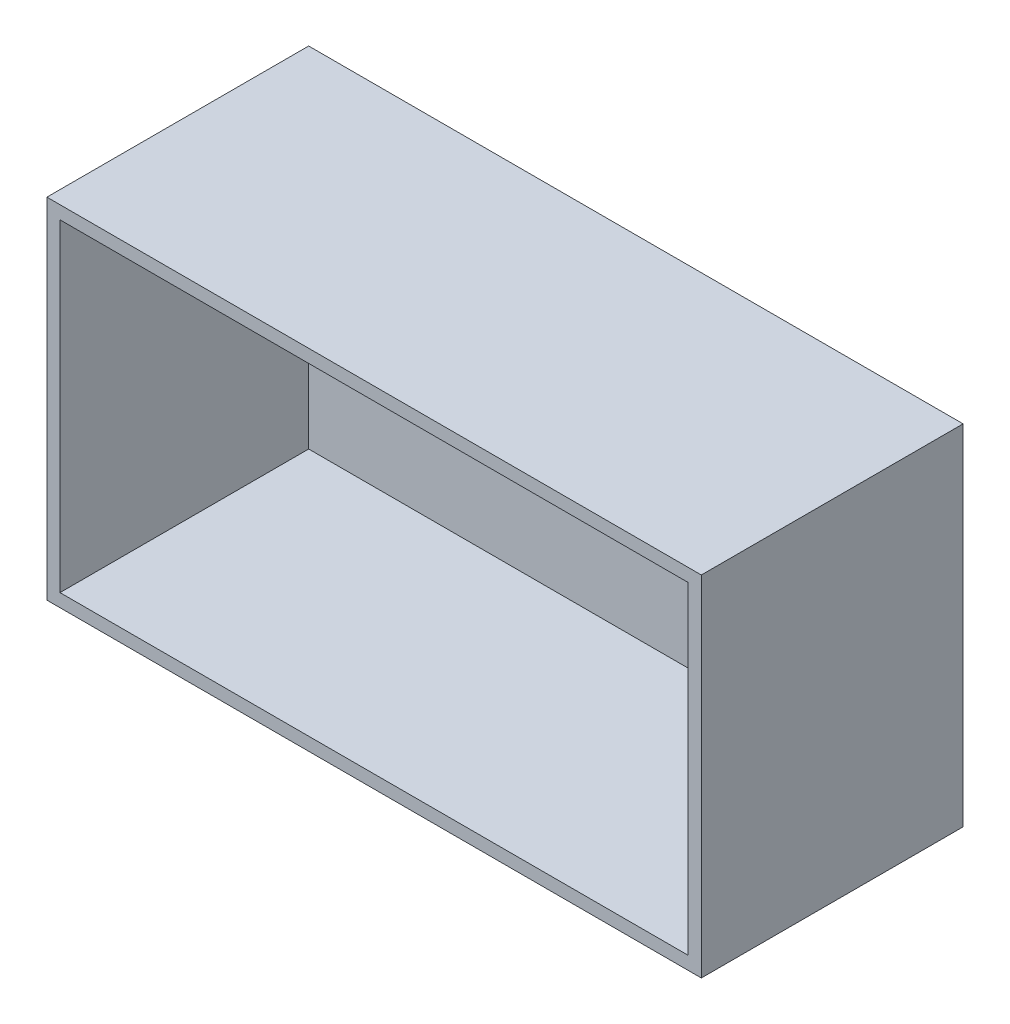
ISO-10303-21;
HEADER;
FILE_DESCRIPTION(('STEP AP214'),'2;1');
FILE_NAME('part.step','',(''),(''),'','','');
FILE_SCHEMA(('AUTOMOTIVE_DESIGN { 1 0 10303 214 1 1 1 1 }'));
ENDSEC;
DATA;
#1=APPLICATION_CONTEXT('core data for automotive mechanical design processes');
#2=APPLICATION_PROTOCOL_DEFINITION('international standard','automotive_design',2000,#1);
#3=PRODUCT_CONTEXT('',#1,'mechanical');
#4=PRODUCT('Part','Part','',(#3));
#5=PRODUCT_RELATED_PRODUCT_CATEGORY('part','',(#4));
#6=PRODUCT_DEFINITION_FORMATION('','',#4);
#7=PRODUCT_DEFINITION_CONTEXT('part definition',#1,'design');
#8=PRODUCT_DEFINITION('design','',#6,#7);
#9=PRODUCT_DEFINITION_SHAPE('','',#8);
#10=(LENGTH_UNIT() NAMED_UNIT(*) SI_UNIT(.MILLI.,.METRE.));
#11=(NAMED_UNIT(*) PLANE_ANGLE_UNIT() SI_UNIT($,.RADIAN.));
#12=(NAMED_UNIT(*) SI_UNIT($,.STERADIAN.) SOLID_ANGLE_UNIT());
#13=UNCERTAINTY_MEASURE_WITH_UNIT(LENGTH_MEASURE(1.E-05),#10,'distance_accuracy_value','');
#14=(GEOMETRIC_REPRESENTATION_CONTEXT(3) GLOBAL_UNCERTAINTY_ASSIGNED_CONTEXT((#13)) GLOBAL_UNIT_ASSIGNED_CONTEXT((#10,
#11,#12)) REPRESENTATION_CONTEXT('',''));
#15=CARTESIAN_POINT('',(0.,0.,0.));
#16=DIRECTION('',(0.,0.,1.));
#17=DIRECTION('',(1.,0.,0.));
#18=AXIS2_PLACEMENT_3D('',#15,#16,#17);
#19=CARTESIAN_POINT('',(0.,0.,60.));
#20=DIRECTION('',(0.,0.,-1.));
#21=DIRECTION('',(-1.,0.,0.));
#22=AXIS2_PLACEMENT_3D('',#19,#20,#21);
#23=PLANE('',#22);
#24=DIRECTION('',(0.,-1.,0.));
#25=VECTOR('',#24,1.);
#26=CARTESIAN_POINT('',(0.,0.,60.));
#27=LINE('',#26,#25);
#28=CARTESIAN_POINT('',(0.,80.,60.));
#29=VERTEX_POINT('',#28);
#30=CARTESIAN_POINT('',(0.,0.,60.));
#31=VERTEX_POINT('',#30);
#32=EDGE_CURVE('E141',#29,#31,#27,.T.);
#33=ORIENTED_EDGE('',*,*,#32,.T.);
#34=DIRECTION('',(1.,0.,0.));
#35=VECTOR('',#34,1.);
#36=CARTESIAN_POINT('',(0.,0.,60.));
#37=LINE('',#36,#35);
#38=CARTESIAN_POINT('',(150.,0.,60.));
#39=VERTEX_POINT('',#38);
#40=EDGE_CURVE('E85',#31,#39,#37,.T.);
#41=ORIENTED_EDGE('',*,*,#40,.T.);
#42=DIRECTION('',(0.,1.,0.));
#43=VECTOR('',#42,1.);
#44=CARTESIAN_POINT('',(150.,0.,60.));
#45=LINE('',#44,#43);
#46=CARTESIAN_POINT('',(150.,80.,60.));
#47=VERTEX_POINT('',#46);
#48=EDGE_CURVE('E144',#39,#47,#45,.T.);
#49=ORIENTED_EDGE('',*,*,#48,.T.);
#50=DIRECTION('',(-1.,0.,0.));
#51=VECTOR('',#50,1.);
#52=CARTESIAN_POINT('',(0.,80.,60.));
#53=LINE('',#52,#51);
#54=EDGE_CURVE('E57',#47,#29,#53,.T.);
#55=ORIENTED_EDGE('',*,*,#54,.T.);
#56=EDGE_LOOP('',(#33,#41,#49,#55));
#57=FACE_BOUND('',#56,.T.);
#58=DIRECTION('',(0.,-1.,0.));
#59=VECTOR('',#58,1.);
#60=CARTESIAN_POINT('',(3.,0.,60.));
#61=LINE('',#60,#59);
#62=CARTESIAN_POINT('',(3.,77.,60.));
#63=VERTEX_POINT('',#62);
#64=CARTESIAN_POINT('',(3.,3.,60.));
#65=VERTEX_POINT('',#64);
#66=EDGE_CURVE('E130',#63,#65,#61,.T.);
#67=ORIENTED_EDGE('',*,*,#66,.F.);
#68=DIRECTION('',(-1.,0.,0.));
#69=VECTOR('',#68,1.);
#70=CARTESIAN_POINT('',(0.,77.,60.));
#71=LINE('',#70,#69);
#72=CARTESIAN_POINT('',(147.,77.,60.));
#73=VERTEX_POINT('',#72);
#74=EDGE_CURVE('E139',#73,#63,#71,.T.);
#75=ORIENTED_EDGE('',*,*,#74,.F.);
#76=DIRECTION('',(0.,1.,0.));
#77=VECTOR('',#76,1.);
#78=CARTESIAN_POINT('',(147.,0.,60.));
#79=LINE('',#78,#77);
#80=CARTESIAN_POINT('',(147.,3.,60.));
#81=VERTEX_POINT('',#80);
#82=EDGE_CURVE('E137',#81,#73,#79,.T.);
#83=ORIENTED_EDGE('',*,*,#82,.F.);
#84=DIRECTION('',(1.,0.,0.));
#85=VECTOR('',#84,1.);
#86=CARTESIAN_POINT('',(0.,3.,60.));
#87=LINE('',#86,#85);
#88=EDGE_CURVE('E122',#65,#81,#87,.T.);
#89=ORIENTED_EDGE('',*,*,#88,.F.);
#90=EDGE_LOOP('',(#67,#75,#83,#89));
#91=FACE_BOUND('',#90,.T.);
#92=ADVANCED_FACE('F33',(#57,#91),#23,.F.);
#93=CARTESIAN_POINT('',(0.,0.,60.));
#94=DIRECTION('',(1.,0.,0.));
#95=DIRECTION('',(0.,0.,-1.));
#96=AXIS2_PLACEMENT_3D('',#93,#94,#95);
#97=PLANE('',#96);
#98=DIRECTION('',(0.,-1.,0.));
#99=VECTOR('',#98,1.);
#100=CARTESIAN_POINT('',(0.,0.,0.));
#101=LINE('',#100,#99);
#102=CARTESIAN_POINT('',(0.,80.,0.));
#103=VERTEX_POINT('',#102);
#104=CARTESIAN_POINT('',(0.,0.,0.));
#105=VERTEX_POINT('',#104);
#106=EDGE_CURVE('E148',#103,#105,#101,.T.);
#107=ORIENTED_EDGE('',*,*,#106,.T.);
#108=DIRECTION('',(0.,0.,-1.));
#109=VECTOR('',#108,1.);
#110=CARTESIAN_POINT('',(0.,0.,60.));
#111=LINE('',#110,#109);
#112=EDGE_CURVE('E11',#31,#105,#111,.T.);
#113=ORIENTED_EDGE('',*,*,#112,.F.);
#114=ORIENTED_EDGE('',*,*,#32,.F.);
#115=DIRECTION('',(0.,0.,-1.));
#116=VECTOR('',#115,1.);
#117=CARTESIAN_POINT('',(0.,80.,60.));
#118=LINE('',#117,#116);
#119=EDGE_CURVE('E147',#29,#103,#118,.T.);
#120=ORIENTED_EDGE('',*,*,#119,.T.);
#121=EDGE_LOOP('',(#107,#113,#114,#120));
#122=FACE_BOUND('',#121,.T.);
#123=ADVANCED_FACE('F35',(#122),#97,.F.);
#124=CARTESIAN_POINT('',(0.,0.,60.));
#125=DIRECTION('',(0.,1.,0.));
#126=DIRECTION('',(0.,0.,1.));
#127=AXIS2_PLACEMENT_3D('',#124,#125,#126);
#128=PLANE('',#127);
#129=DIRECTION('',(1.,0.,0.));
#130=VECTOR('',#129,1.);
#131=CARTESIAN_POINT('',(0.,0.,0.));
#132=LINE('',#131,#130);
#133=CARTESIAN_POINT('',(150.,0.,0.));
#134=VERTEX_POINT('',#133);
#135=EDGE_CURVE('E151',#105,#134,#132,.T.);
#136=ORIENTED_EDGE('',*,*,#135,.T.);
#137=DIRECTION('',(0.,0.,-1.));
#138=VECTOR('',#137,1.);
#139=CARTESIAN_POINT('',(150.,0.,60.));
#140=LINE('',#139,#138);
#141=EDGE_CURVE('E41',#39,#134,#140,.T.);
#142=ORIENTED_EDGE('',*,*,#141,.F.);
#143=ORIENTED_EDGE('',*,*,#40,.F.);
#144=ORIENTED_EDGE('',*,*,#112,.T.);
#145=EDGE_LOOP('',(#136,#142,#143,#144));
#146=FACE_BOUND('',#145,.T.);
#147=ADVANCED_FACE('F179',(#146),#128,.F.);
#148=CARTESIAN_POINT('',(150.,0.,60.));
#149=DIRECTION('',(-1.,0.,0.));
#150=DIRECTION('',(0.,0.,1.));
#151=AXIS2_PLACEMENT_3D('',#148,#149,#150);
#152=PLANE('',#151);
#153=DIRECTION('',(0.,1.,0.));
#154=VECTOR('',#153,1.);
#155=CARTESIAN_POINT('',(150.,0.,0.));
#156=LINE('',#155,#154);
#157=CARTESIAN_POINT('',(150.,80.,0.));
#158=VERTEX_POINT('',#157);
#159=EDGE_CURVE('E153',#134,#158,#156,.T.);
#160=ORIENTED_EDGE('',*,*,#159,.T.);
#161=DIRECTION('',(0.,0.,-1.));
#162=VECTOR('',#161,1.);
#163=CARTESIAN_POINT('',(150.,80.,60.));
#164=LINE('',#163,#162);
#165=EDGE_CURVE('E157',#47,#158,#164,.T.);
#166=ORIENTED_EDGE('',*,*,#165,.F.);
#167=ORIENTED_EDGE('',*,*,#48,.F.);
#168=ORIENTED_EDGE('',*,*,#141,.T.);
#169=EDGE_LOOP('',(#160,#166,#167,#168));
#170=FACE_BOUND('',#169,.T.);
#171=ADVANCED_FACE('F162',(#170),#152,.F.);
#172=CARTESIAN_POINT('',(0.,80.,60.));
#173=DIRECTION('',(0.,-1.,0.));
#174=DIRECTION('',(0.,0.,-1.));
#175=AXIS2_PLACEMENT_3D('',#172,#173,#174);
#176=PLANE('',#175);
#177=DIRECTION('',(-1.,0.,0.));
#178=VECTOR('',#177,1.);
#179=CARTESIAN_POINT('',(0.,80.,0.));
#180=LINE('',#179,#178);
#181=EDGE_CURVE('E78',#158,#103,#180,.T.);
#182=ORIENTED_EDGE('',*,*,#181,.T.);
#183=ORIENTED_EDGE('',*,*,#119,.F.);
#184=ORIENTED_EDGE('',*,*,#54,.F.);
#185=ORIENTED_EDGE('',*,*,#165,.T.);
#186=EDGE_LOOP('',(#182,#183,#184,#185));
#187=FACE_BOUND('',#186,.T.);
#188=ADVANCED_FACE('F170',(#187),#176,.F.);
#189=CARTESIAN_POINT('',(0.,0.,0.));
#190=DIRECTION('',(0.,0.,-1.));
#191=DIRECTION('',(-1.,0.,0.));
#192=AXIS2_PLACEMENT_3D('',#189,#190,#191);
#193=PLANE('',#192);
#194=ORIENTED_EDGE('',*,*,#106,.F.);
#195=ORIENTED_EDGE('',*,*,#181,.F.);
#196=ORIENTED_EDGE('',*,*,#159,.F.);
#197=ORIENTED_EDGE('',*,*,#135,.F.);
#198=EDGE_LOOP('',(#194,#195,#196,#197));
#199=FACE_BOUND('',#198,.T.);
#200=ADVANCED_FACE('F166',(#199),#193,.T.);
#201=CARTESIAN_POINT('',(3.,0.,60.));
#202=DIRECTION('',(1.,0.,0.));
#203=DIRECTION('',(0.,0.,-1.));
#204=AXIS2_PLACEMENT_3D('',#201,#202,#203);
#205=PLANE('',#204);
#206=DIRECTION('',(0.,-1.,0.));
#207=VECTOR('',#206,1.);
#208=CARTESIAN_POINT('',(3.,0.,3.));
#209=LINE('',#208,#207);
#210=CARTESIAN_POINT('',(3.,77.,3.));
#211=VERTEX_POINT('',#210);
#212=CARTESIAN_POINT('',(3.,3.,3.));
#213=VERTEX_POINT('',#212);
#214=EDGE_CURVE('E113',#211,#213,#209,.T.);
#215=ORIENTED_EDGE('',*,*,#214,.F.);
#216=DIRECTION('',(0.,0.,-1.));
#217=VECTOR('',#216,1.);
#218=CARTESIAN_POINT('',(3.,77.,60.));
#219=LINE('',#218,#217);
#220=EDGE_CURVE('E133',#63,#211,#219,.T.);
#221=ORIENTED_EDGE('',*,*,#220,.F.);
#222=ORIENTED_EDGE('',*,*,#66,.T.);
#223=DIRECTION('',(0.,0.,-1.));
#224=VECTOR('',#223,1.);
#225=CARTESIAN_POINT('',(3.,3.,60.));
#226=LINE('',#225,#224);
#227=EDGE_CURVE('E125',#65,#213,#226,.T.);
#228=ORIENTED_EDGE('',*,*,#227,.T.);
#229=EDGE_LOOP('',(#215,#221,#222,#228));
#230=FACE_BOUND('',#229,.T.);
#231=ADVANCED_FACE('F177',(#230),#205,.T.);
#232=CARTESIAN_POINT('',(0.,3.,60.));
#233=DIRECTION('',(0.,1.,0.));
#234=DIRECTION('',(0.,0.,1.));
#235=AXIS2_PLACEMENT_3D('',#232,#233,#234);
#236=PLANE('',#235);
#237=DIRECTION('',(1.,0.,0.));
#238=VECTOR('',#237,1.);
#239=CARTESIAN_POINT('',(0.,3.,3.));
#240=LINE('',#239,#238);
#241=CARTESIAN_POINT('',(147.,3.,3.));
#242=VERTEX_POINT('',#241);
#243=EDGE_CURVE('E107',#213,#242,#240,.T.);
#244=ORIENTED_EDGE('',*,*,#243,.F.);
#245=ORIENTED_EDGE('',*,*,#227,.F.);
#246=ORIENTED_EDGE('',*,*,#88,.T.);
#247=DIRECTION('',(0.,0.,-1.));
#248=VECTOR('',#247,1.);
#249=CARTESIAN_POINT('',(147.,3.,60.));
#250=LINE('',#249,#248);
#251=EDGE_CURVE('E119',#81,#242,#250,.T.);
#252=ORIENTED_EDGE('',*,*,#251,.T.);
#253=EDGE_LOOP('',(#244,#245,#246,#252));
#254=FACE_BOUND('',#253,.T.);
#255=ADVANCED_FACE('F120',(#254),#236,.T.);
#256=CARTESIAN_POINT('',(147.,0.,60.));
#257=DIRECTION('',(-1.,0.,0.));
#258=DIRECTION('',(0.,0.,1.));
#259=AXIS2_PLACEMENT_3D('',#256,#257,#258);
#260=PLANE('',#259);
#261=DIRECTION('',(0.,1.,0.));
#262=VECTOR('',#261,1.);
#263=CARTESIAN_POINT('',(147.,0.,3.));
#264=LINE('',#263,#262);
#265=CARTESIAN_POINT('',(147.,77.,3.));
#266=VERTEX_POINT('',#265);
#267=EDGE_CURVE('E111',#242,#266,#264,.T.);
#268=ORIENTED_EDGE('',*,*,#267,.F.);
#269=ORIENTED_EDGE('',*,*,#251,.F.);
#270=ORIENTED_EDGE('',*,*,#82,.T.);
#271=DIRECTION('',(0.,0.,-1.));
#272=VECTOR('',#271,1.);
#273=CARTESIAN_POINT('',(147.,77.,60.));
#274=LINE('',#273,#272);
#275=EDGE_CURVE('E48',#73,#266,#274,.T.);
#276=ORIENTED_EDGE('',*,*,#275,.T.);
#277=EDGE_LOOP('',(#268,#269,#270,#276));
#278=FACE_BOUND('',#277,.T.);
#279=ADVANCED_FACE('F127',(#278),#260,.T.);
#280=CARTESIAN_POINT('',(0.,77.,60.));
#281=DIRECTION('',(0.,-1.,0.));
#282=DIRECTION('',(0.,0.,-1.));
#283=AXIS2_PLACEMENT_3D('',#280,#281,#282);
#284=PLANE('',#283);
#285=DIRECTION('',(-1.,0.,0.));
#286=VECTOR('',#285,1.);
#287=CARTESIAN_POINT('',(0.,77.,3.));
#288=LINE('',#287,#286);
#289=EDGE_CURVE('E128',#266,#211,#288,.T.);
#290=ORIENTED_EDGE('',*,*,#289,.F.);
#291=ORIENTED_EDGE('',*,*,#275,.F.);
#292=ORIENTED_EDGE('',*,*,#74,.T.);
#293=ORIENTED_EDGE('',*,*,#220,.T.);
#294=EDGE_LOOP('',(#290,#291,#292,#293));
#295=FACE_BOUND('',#294,.T.);
#296=ADVANCED_FACE('F190',(#295),#284,.T.);
#297=CARTESIAN_POINT('',(0.,0.,3.));
#298=DIRECTION('',(0.,0.,-1.));
#299=DIRECTION('',(-1.,0.,0.));
#300=AXIS2_PLACEMENT_3D('',#297,#298,#299);
#301=PLANE('',#300);
#302=ORIENTED_EDGE('',*,*,#214,.T.);
#303=ORIENTED_EDGE('',*,*,#243,.T.);
#304=ORIENTED_EDGE('',*,*,#267,.T.);
#305=ORIENTED_EDGE('',*,*,#289,.T.);
#306=EDGE_LOOP('',(#302,#303,#304,#305));
#307=FACE_BOUND('',#306,.T.);
#308=ADVANCED_FACE('F109',(#307),#301,.F.);
#309=CLOSED_SHELL('',(#92,#123,#147,#171,#188,#200,#231,#255,#279,#296,#308));
#310=MANIFOLD_SOLID_BREP('B2',#309);
#311=ADVANCED_BREP_SHAPE_REPRESENTATION('',(#18,#310),#14);
#312=SHAPE_DEFINITION_REPRESENTATION(#9,#311);
ENDSEC;
END-ISO-10303-21;
